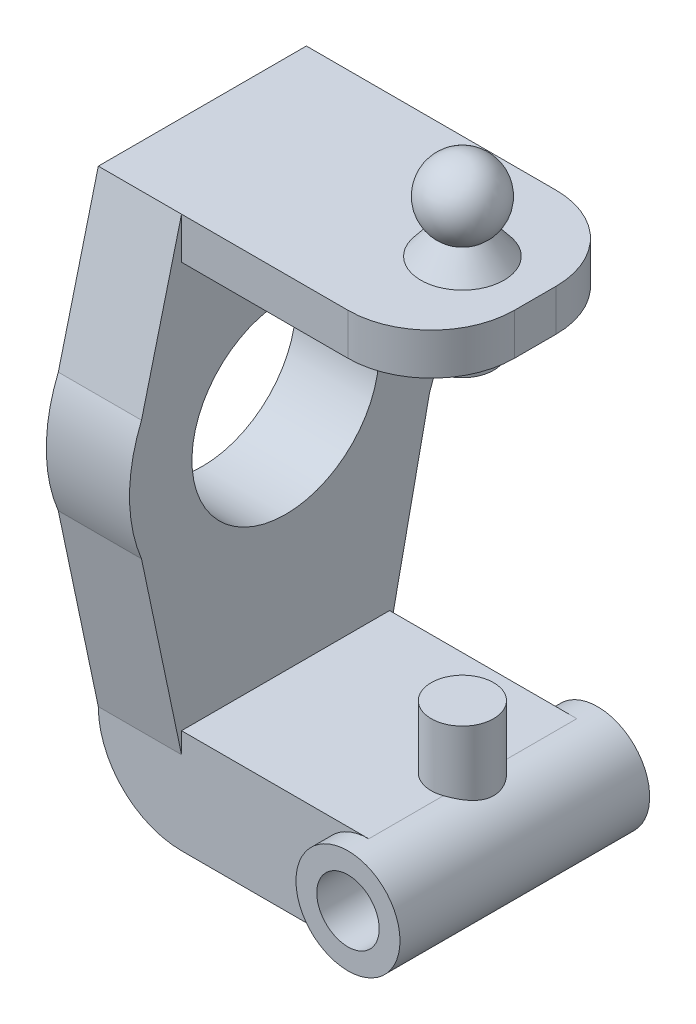
ISO-10303-21;
HEADER;
FILE_DESCRIPTION(('STEP AP214'),'2;1');
FILE_NAME('part.step','',(''),(''),'','','');
FILE_SCHEMA(('AUTOMOTIVE_DESIGN { 1 0 10303 214 1 1 1 1 }'));
ENDSEC;
DATA;
#1=APPLICATION_CONTEXT('core data for automotive mechanical design processes');
#2=APPLICATION_PROTOCOL_DEFINITION('international standard','automotive_design',2000,#1);
#3=PRODUCT_CONTEXT('',#1,'mechanical');
#4=PRODUCT('Part','Part','',(#3));
#5=PRODUCT_RELATED_PRODUCT_CATEGORY('part','',(#4));
#6=PRODUCT_DEFINITION_FORMATION('','',#4);
#7=PRODUCT_DEFINITION_CONTEXT('part definition',#1,'design');
#8=PRODUCT_DEFINITION('design','',#6,#7);
#9=PRODUCT_DEFINITION_SHAPE('','',#8);
#10=(LENGTH_UNIT() NAMED_UNIT(*) SI_UNIT(.MILLI.,.METRE.));
#11=(NAMED_UNIT(*) PLANE_ANGLE_UNIT() SI_UNIT($,.RADIAN.));
#12=(NAMED_UNIT(*) SI_UNIT($,.STERADIAN.) SOLID_ANGLE_UNIT());
#13=UNCERTAINTY_MEASURE_WITH_UNIT(LENGTH_MEASURE(1.E-05),#10,'distance_accuracy_value','');
#14=(GEOMETRIC_REPRESENTATION_CONTEXT(3) GLOBAL_UNCERTAINTY_ASSIGNED_CONTEXT((#13)) GLOBAL_UNIT_ASSIGNED_CONTEXT((#10,
#11,#12)) REPRESENTATION_CONTEXT('',''));
#15=CARTESIAN_POINT('',(0.,0.,0.));
#16=DIRECTION('',(0.,0.,1.));
#17=DIRECTION('',(1.,0.,0.));
#18=AXIS2_PLACEMENT_3D('',#15,#16,#17);
#19=CARTESIAN_POINT('',(4.,4.,10.));
#20=DIRECTION('',(0.,0.,1.));
#21=DIRECTION('',(1.,0.,0.));
#22=AXIS2_PLACEMENT_3D('',#19,#20,#21);
#23=PLANE('',#22);
#24=DIRECTION('',(-1.,0.,0.));
#25=VECTOR('',#24,1.);
#26=CARTESIAN_POINT('',(15.9999999999998,26.4999999999999,10.));
#27=LINE('',#26,#25);
#28=CARTESIAN_POINT('',(11.9999999999998,26.4999999999999,10.));
#29=VERTEX_POINT('',#28);
#30=CARTESIAN_POINT('',(3.99999999999971,26.4999999999999,10.));
#31=VERTEX_POINT('',#30);
#32=EDGE_CURVE('E212',#29,#31,#27,.T.);
#33=ORIENTED_EDGE('',*,*,#32,.T.);
#34=DIRECTION('',(0.,-1.,0.));
#35=VECTOR('',#34,1.);
#36=CARTESIAN_POINT('',(3.99999999999996,4.,10.));
#37=LINE('',#36,#35);
#38=CARTESIAN_POINT('',(3.99999999999979,24.5,10.));
#39=VERTEX_POINT('',#38);
#40=EDGE_CURVE('E193',#31,#39,#37,.T.);
#41=ORIENTED_EDGE('',*,*,#40,.T.);
#42=DIRECTION('',(1.,0.,0.));
#43=VECTOR('',#42,1.);
#44=CARTESIAN_POINT('',(3.99999999999979,24.5,10.));
#45=LINE('',#44,#43);
#46=CARTESIAN_POINT('',(11.9999999999998,24.5,10.));
#47=VERTEX_POINT('',#46);
#48=EDGE_CURVE('E274',#39,#47,#45,.T.);
#49=ORIENTED_EDGE('',*,*,#48,.T.);
#50=DIRECTION('',(0.,1.,0.));
#51=VECTOR('',#50,1.);
#52=CARTESIAN_POINT('',(11.9999999999998,26.4999999999999,10.));
#53=LINE('',#52,#51);
#54=EDGE_CURVE('E247',#47,#29,#53,.T.);
#55=ORIENTED_EDGE('',*,*,#54,.T.);
#56=EDGE_LOOP('',(#33,#41,#49,#55));
#57=FACE_BOUND('',#56,.T.);
#58=ADVANCED_FACE('F35',(#57),#23,.T.);
#59=CARTESIAN_POINT('',(4.,4.,0.));
#60=DIRECTION('',(0.,0.,1.));
#61=DIRECTION('',(1.,0.,0.));
#62=AXIS2_PLACEMENT_3D('',#59,#60,#61);
#63=PLANE('',#62);
#64=DIRECTION('',(0.,-1.,0.));
#65=VECTOR('',#64,1.);
#66=CARTESIAN_POINT('',(3.99999999999996,4.,0.));
#67=LINE('',#66,#65);
#68=CARTESIAN_POINT('',(3.99999999999971,26.5,0.));
#69=VERTEX_POINT('',#68);
#70=CARTESIAN_POINT('',(3.99999999999973,24.5,0.));
#71=VERTEX_POINT('',#70);
#72=EDGE_CURVE('E178',#69,#71,#67,.T.);
#73=ORIENTED_EDGE('',*,*,#72,.F.);
#74=DIRECTION('',(-1.,0.,0.));
#75=VECTOR('',#74,1.);
#76=CARTESIAN_POINT('',(15.9999999999998,26.4999999999999,0.));
#77=LINE('',#76,#75);
#78=CARTESIAN_POINT('',(11.9999999999998,26.4999999999999,0.));
#79=VERTEX_POINT('',#78);
#80=EDGE_CURVE('E189',#79,#69,#77,.T.);
#81=ORIENTED_EDGE('',*,*,#80,.F.);
#82=DIRECTION('',(0.,1.,0.));
#83=VECTOR('',#82,1.);
#84=CARTESIAN_POINT('',(11.9999999999997,3.99999999999997,0.));
#85=LINE('',#84,#83);
#86=CARTESIAN_POINT('',(11.9999999999998,24.5,0.));
#87=VERTEX_POINT('',#86);
#88=EDGE_CURVE('E241',#79,#87,#85,.F.);
#89=ORIENTED_EDGE('',*,*,#88,.T.);
#90=DIRECTION('',(1.,0.,0.));
#91=VECTOR('',#90,1.);
#92=CARTESIAN_POINT('',(3.99999999999979,24.5,0.));
#93=LINE('',#92,#91);
#94=EDGE_CURVE('E192',#71,#87,#93,.T.);
#95=ORIENTED_EDGE('',*,*,#94,.F.);
#96=EDGE_LOOP('',(#73,#81,#89,#95));
#97=FACE_BOUND('',#96,.T.);
#98=ADVANCED_FACE('F188',(#97),#63,.F.);
#99=CARTESIAN_POINT('',(13.,2.5,10.));
#100=DIRECTION('',(0.,0.,-1.));
#101=DIRECTION('',(-1.,0.,0.));
#102=AXIS2_PLACEMENT_3D('',#99,#100,#101);
#103=CYLINDRICAL_SURFACE('',#102,2.5);
#104=CARTESIAN_POINT('',(13.,2.5,11.));
#105=DIRECTION('',(0.,0.,1.));
#106=DIRECTION('',(1.,0.,0.));
#107=AXIS2_PLACEMENT_3D('',#104,#105,#106);
#108=CIRCLE('',#107,2.5);
#109=CARTESIAN_POINT('',(15.5,2.5,11.));
#110=VERTEX_POINT('',#109);
#111=EDGE_CURVE('E387',#110,#110,#108,.T.);
#112=ORIENTED_EDGE('',*,*,#111,.F.);
#113=EDGE_LOOP('',(#112));
#114=FACE_BOUND('',#113,.T.);
#115=CARTESIAN_POINT('',(13.,2.5,-1.));
#116=DIRECTION('',(0.,0.,-1.));
#117=DIRECTION('',(-1.,0.,0.));
#118=AXIS2_PLACEMENT_3D('',#115,#116,#117);
#119=CIRCLE('',#118,2.5);
#120=CARTESIAN_POINT('',(10.5,2.5,-1.));
#121=VERTEX_POINT('',#120);
#122=EDGE_CURVE('E285',#121,#121,#119,.T.);
#123=ORIENTED_EDGE('',*,*,#122,.F.);
#124=EDGE_LOOP('',(#123));
#125=FACE_BOUND('',#124,.T.);
#126=CARTESIAN_POINT('',(13.9999999999998,4.791287847478,5.));
#127=CARTESIAN_POINT('',(13.9999947033153,4.79129466114536,4.91902982811537));
#128=CARTESIAN_POINT('',(13.9934082098024,4.79419981165906,4.83797576123157));
#129=CARTESIAN_POINT('',(13.9673319524589,4.80531081160834,4.67827041177201));
#130=CARTESIAN_POINT('',(13.9478192762301,4.81352607289022,4.59962365574422));
#131=CARTESIAN_POINT('',(13.896741534318,4.83379524979815,4.44723737961263));
#132=CARTESIAN_POINT('',(13.8652227052549,4.84583441010019,4.37348029266181));
#133=CARTESIAN_POINT('',(13.7910603269541,4.87186911270049,4.23218816346976));
#134=CARTESIAN_POINT('',(13.7484154490711,4.88586488856024,4.16465386564289));
#135=CARTESIAN_POINT('',(13.6503192221696,4.91450471744164,4.03365500113123));
#136=CARTESIAN_POINT('',(13.5942925899535,4.92914209638642,3.97061845896466));
#137=CARTESIAN_POINT('',(13.4721255535835,4.95580952497532,3.85454452277904));
#138=CARTESIAN_POINT('',(13.4059849663847,4.967839527421,3.80150730976905));
#139=CARTESIAN_POINT('',(13.2653141747865,4.9868912943366,3.70715585296549));
#140=CARTESIAN_POINT('',(13.1908018840092,4.99392352519673,3.66581721986018));
#141=CARTESIAN_POINT('',(13.0355797767526,5.00094898556523,3.59630256858329));
#142=CARTESIAN_POINT('',(12.9548759878743,5.00094897634477,3.56811393319789));
#143=CARTESIAN_POINT('',(12.7984894426624,4.99297105103094,3.52800751353057));
#144=CARTESIAN_POINT('',(12.7231078550698,4.98578821718202,3.51474814373359));
#145=CARTESIAN_POINT('',(12.5722253082833,4.9643072012322,3.49982419435114));
#146=CARTESIAN_POINT('',(12.4967243691026,4.95001010718521,3.4981578423149));
#147=CARTESIAN_POINT('',(12.3510544630052,4.91541852344314,3.50570502203827));
#148=CARTESIAN_POINT('',(12.280794501245,4.89539943546448,3.51446708920398));
#149=CARTESIAN_POINT('',(12.1438973285934,4.84995662832058,3.54121286836431));
#150=CARTESIAN_POINT('',(12.0772610745585,4.82453149028151,3.55919900306424));
#151=CARTESIAN_POINT('',(11.9425987208532,4.76666542303225,3.60542317605964));
#152=CARTESIAN_POINT('',(11.8750420991718,4.73378743205334,3.63447289377611));
#153=CARTESIAN_POINT('',(11.746388370658,4.66421290927768,3.70102976911739));
#154=CARTESIAN_POINT('',(11.6852952765501,4.62751403309972,3.73854213583592));
#155=CARTESIAN_POINT('',(11.559143405989,4.5446613732338,3.82872621540731));
#156=CARTESIAN_POINT('',(11.4954918775131,4.49802567403082,3.88292168398297));
#157=CARTESIAN_POINT('',(11.3781658470256,4.40402301470902,4.00079181624802));
#158=CARTESIAN_POINT('',(11.3245014626109,4.35665536511124,4.06447597626547));
#159=CARTESIAN_POINT('',(11.2336413572786,4.27014570598054,4.19269941162114));
#160=CARTESIAN_POINT('',(11.1952336905834,4.23070669935142,4.25617908850194));
#161=CARTESIAN_POINT('',(11.1273489322538,4.15700661418471,4.39051523587173));
#162=CARTESIAN_POINT('',(11.0978533191028,4.12273487211329,4.46135599032846));
#163=CARTESIAN_POINT('',(11.0570342646703,4.07339482783833,4.5868262316259));
#164=CARTESIAN_POINT('',(11.0429140502632,4.05568209810313,4.6394859039536));
#165=CARTESIAN_POINT('',(11.0203377152544,4.02685149101053,4.74772551219101));
#166=CARTESIAN_POINT('',(11.0118705769798,4.0157207903495,4.80329953864547));
#167=CARTESIAN_POINT('',(11.0012310367635,4.0016690452409,4.91663240370038));
#168=CARTESIAN_POINT('',(10.9991147716521,3.99882122181047,4.97440618136213));
#169=CARTESIAN_POINT('',(11.001567275606,4.00208795885401,5.08956117181218));
#170=CARTESIAN_POINT('',(11.0061389970681,4.00820647750183,5.14694219998576));
#171=CARTESIAN_POINT('',(11.0222630544285,4.02929407693945,5.26492958137885));
#172=CARTESIAN_POINT('',(11.0344597689819,4.04507701334854,5.32529538154871));
#173=CARTESIAN_POINT('',(11.0653376902947,4.08356808130808,5.44205415332639));
#174=CARTESIAN_POINT('',(11.0840355056846,4.10629393198987,5.4984365000176));
#175=CARTESIAN_POINT('',(11.1376391340598,4.16853537799262,5.63370662728523));
#176=CARTESIAN_POINT('',(11.1759881694794,4.21079771238277,5.70994416283519));
#177=CARTESIAN_POINT('',(11.2634340877537,4.29951370246557,5.85320703026029));
#178=CARTESIAN_POINT('',(11.3125482970288,4.34597404312017,5.92021722444118));
#179=CARTESIAN_POINT('',(11.4231892364001,4.44145256593362,6.04780905264394));
#180=CARTESIAN_POINT('',(11.4851596734395,4.4904946925293,6.10798919310763));
#181=CARTESIAN_POINT('',(11.6196361500555,4.58599801488471,6.21756475449463));
#182=CARTESIAN_POINT('',(11.6921290548821,4.63246232991229,6.26697343137785));
#183=CARTESIAN_POINT('',(11.83733622895,4.71455776851969,6.34791748162733));
#184=CARTESIAN_POINT('',(11.9088706993709,4.75081615880801,6.38092077493516));
#185=CARTESIAN_POINT('',(12.0586831740852,4.81746171744578,6.43582468824335));
#186=CARTESIAN_POINT('',(12.13695838266,4.8478513030836,6.45772988547444));
#187=CARTESIAN_POINT('',(12.2991784603328,4.9012888616434,6.4888034373489));
#188=CARTESIAN_POINT('',(12.3831627935634,4.92427771573521,6.4978711029577));
#189=CARTESIAN_POINT('',(12.5533823798198,4.96131988002796,6.50145774316056));
#190=CARTESIAN_POINT('',(12.6396156042979,4.9753809715385,6.49598940874742));
#191=CARTESIAN_POINT('',(12.7994909397959,4.99307156988658,6.47172209125191));
#192=CARTESIAN_POINT('',(12.8732963211057,4.9978305451557,6.45477254162018));
#193=CARTESIAN_POINT('',(13.0176172692153,5.00097932890752,6.40988677052859));
#194=CARTESIAN_POINT('',(13.088132899685,4.99936926070857,6.38195076179957));
#195=CARTESIAN_POINT('',(13.2224000269212,4.990978526665,6.31666106934536));
#196=CARTESIAN_POINT('',(13.2862645274208,4.98431001281661,6.27952326526576));
#197=CARTESIAN_POINT('',(13.4075304636663,4.96732088159484,6.19657417430765));
#198=CARTESIAN_POINT('',(13.4649302524364,4.95699933632249,6.15076068511221));
#199=CARTESIAN_POINT('',(13.5770745061971,4.93322059120753,6.04702461663845));
#200=CARTESIAN_POINT('',(13.6311105928959,4.91956434995894,5.98838198916769));
#201=CARTESIAN_POINT('',(13.7292351077018,4.89182418192636,5.86331133928975));
#202=CARTESIAN_POINT('',(13.7733143956897,4.87773987553319,5.79687624786792));
#203=CARTESIAN_POINT('',(13.8533983897154,4.85024228810602,5.65240459898935));
#204=CARTESIAN_POINT('',(13.8885585768318,4.83695685058172,5.57387266097269));
#205=CARTESIAN_POINT('',(13.9449985389368,4.8147168507385,5.41149742283211));
#206=CARTESIAN_POINT('',(13.9663098860385,4.80575244961294,5.32766668530225));
#207=CARTESIAN_POINT('',(13.9868237987631,4.79700255031508,5.20250041948364));
#208=CARTESIAN_POINT('',(13.9917576101384,4.79487036808281,5.16219537902944));
#209=CARTESIAN_POINT('',(13.9983470596554,4.79201129818322,5.0812672745524));
#210=CARTESIAN_POINT('',(14.000002658751,4.79128442725425,5.0406442067474));
#211=CARTESIAN_POINT('',(13.9999999999998,4.791287847478,5.));
#212=B_SPLINE_CURVE_WITH_KNOTS('',3,(#126,#127,#128,#129,#130,#131,#132,#133,#134,#135,#136,
#137,#138,#139,#140,#141,#142,#143,#144,#145,#146,#147,#148,#149,#150,#151,#152,#153,#154,#155,
#156,#157,#158,#159,#160,#161,#162,#163,#164,#165,#166,#167,#168,#169,#170,#171,#172,#173,#174,
#175,#176,#177,#178,#179,#180,#181,#182,#183,#184,#185,#186,#187,#188,#189,#190,#191,#192,#193,
#194,#195,#196,#197,#198,#199,#200,#201,#202,#203,#204,#205,#206,#207,#208,#209,#210,#211),
.UNSPECIFIED.,.T.,.F.,(4,2,2,2,2,2,2,2,2,2,2,2,2,2,2,2,2,2,2,2,2,2,2,2,2,2,2,2,2,2,2,2,2,2,2,2,
2,2,2,2,2,2,4),(0.,0.242748105193682,0.485927650764511,0.728180009229197,0.970461310124554,
1.22606593439605,1.48167518520909,1.73674754611882,1.99157466321206,2.22100558352159,
2.45040142547996,2.67021712909591,2.89009059699212,3.13085440720251,3.3717668233517,
3.65788856734964,3.94429861108068,4.19563758597558,4.44645056361101,4.61784267773913,
4.78889977108684,4.96146448841713,5.13410540704983,5.32378394794143,5.51395067285492,
5.79810903790789,6.08272815546154,6.37961304655251,6.67613048593362,6.93527054130685,
7.19430363136125,7.4553573567848,7.71618323805837,7.94267707996984,8.16916653649589,
8.39077610058662,8.61244199571269,8.85413384379524,9.09604666601435,9.35595408738874,
9.6152668824166,9.7371165269493,9.85896762279592),.UNSPECIFIED.);
#213=CARTESIAN_POINT('',(13.,5.,6.41421356237303));
#214=VERTEX_POINT('',#213);
#215=CARTESIAN_POINT('',(13.,5.,3.58578643762697));
#216=VERTEX_POINT('',#215);
#217=EDGE_CURVE('E308',#214,#216,#212,.T.);
#218=ORIENTED_EDGE('',*,*,#217,.F.);
#219=DIRECTION('',(0.,0.,-1.));
#220=VECTOR('',#219,1.);
#221=CARTESIAN_POINT('',(13.,5.,10.));
#222=LINE('',#221,#220);
#223=CARTESIAN_POINT('',(13.,5.,10.));
#224=VERTEX_POINT('',#223);
#225=EDGE_CURVE('E224',#224,#214,#222,.T.);
#226=ORIENTED_EDGE('',*,*,#225,.F.);
#227=CARTESIAN_POINT('',(13.,2.5,10.));
#228=DIRECTION('',(0.,0.,1.));
#229=DIRECTION('',(1.,0.,0.));
#230=AXIS2_PLACEMENT_3D('',#227,#228,#229);
#231=CIRCLE('',#230,2.5);
#232=CARTESIAN_POINT('',(13.,0.,10.));
#233=VERTEX_POINT('',#232);
#234=EDGE_CURVE('E396',#224,#233,#231,.T.);
#235=ORIENTED_EDGE('',*,*,#234,.T.);
#236=DIRECTION('',(0.,0.,-1.));
#237=VECTOR('',#236,1.);
#238=CARTESIAN_POINT('',(13.,0.,10.));
#239=LINE('',#238,#237);
#240=CARTESIAN_POINT('',(13.,0.,0.));
#241=VERTEX_POINT('',#240);
#242=EDGE_CURVE('E226',#233,#241,#239,.T.);
#243=ORIENTED_EDGE('',*,*,#242,.T.);
#244=CARTESIAN_POINT('',(13.,2.5,0.));
#245=DIRECTION('',(0.,0.,-1.));
#246=DIRECTION('',(-1.,0.,0.));
#247=AXIS2_PLACEMENT_3D('',#244,#245,#246);
#248=CIRCLE('',#247,2.5);
#249=CARTESIAN_POINT('',(13.,5.,0.));
#250=VERTEX_POINT('',#249);
#251=EDGE_CURVE('E232',#241,#250,#248,.T.);
#252=ORIENTED_EDGE('',*,*,#251,.T.);
#253=EDGE_CURVE('E223',#216,#250,#222,.T.);
#254=ORIENTED_EDGE('',*,*,#253,.F.);
#255=EDGE_LOOP('',(#218,#226,#235,#243,#252,#254));
#256=FACE_BOUND('',#255,.T.);
#257=ADVANCED_FACE('F319',(#114,#125,#256),#103,.T.);
#258=DIRECTION('',(-1.,0.,0.));
#259=VECTOR('',#258,1.);
#260=CARTESIAN_POINT('',(3.99999999999996,4.00000000000002,10.));
#261=LINE('',#260,#259);
#262=CARTESIAN_POINT('',(3.99999999999996,4.00000000000002,10.));
#263=VERTEX_POINT('',#262);
#264=CARTESIAN_POINT('',(0.,4.,10.));
#265=VERTEX_POINT('',#264);
#266=EDGE_CURVE('E417',#263,#265,#261,.T.);
#267=ORIENTED_EDGE('',*,*,#266,.T.);
#268=CARTESIAN_POINT('',(4.,4.,10.));
#269=DIRECTION('',(0.,0.,1.));
#270=DIRECTION('',(1.,0.,0.));
#271=AXIS2_PLACEMENT_3D('',#268,#269,#270);
#272=CIRCLE('',#271,4.);
#273=CARTESIAN_POINT('',(4.,0.,10.));
#274=VERTEX_POINT('',#273);
#275=EDGE_CURVE('E199',#265,#274,#272,.T.);
#276=ORIENTED_EDGE('',*,*,#275,.T.);
#277=DIRECTION('',(1.,0.,0.));
#278=VECTOR('',#277,1.);
#279=CARTESIAN_POINT('',(4.,0.,10.));
#280=LINE('',#279,#278);
#281=EDGE_CURVE('E202',#274,#233,#280,.T.);
#282=ORIENTED_EDGE('',*,*,#281,.T.);
#283=ORIENTED_EDGE('',*,*,#234,.F.);
#284=DIRECTION('',(-1.,0.,0.));
#285=VECTOR('',#284,1.);
#286=CARTESIAN_POINT('',(13.,5.,10.));
#287=LINE('',#286,#285);
#288=CARTESIAN_POINT('',(3.99999999999973,5.,10.));
#289=VERTEX_POINT('',#288);
#290=EDGE_CURVE('E275',#224,#289,#287,.T.);
#291=ORIENTED_EDGE('',*,*,#290,.T.);
#292=EDGE_CURVE('E50',#289,#263,#37,.T.);
#293=ORIENTED_EDGE('',*,*,#292,.T.);
#294=EDGE_LOOP('',(#267,#276,#282,#283,#291,#293));
#295=FACE_BOUND('',#294,.T.);
#296=ADVANCED_FACE('F351',(#295),#23,.T.);
#297=CARTESIAN_POINT('',(4.,4.,0.));
#298=DIRECTION('',(0.,0.,1.));
#299=DIRECTION('',(1.,0.,0.));
#300=AXIS2_PLACEMENT_3D('',#297,#298,#299);
#301=CIRCLE('',#300,4.);
#302=CARTESIAN_POINT('',(0.,3.99999999999997,0.));
#303=VERTEX_POINT('',#302);
#304=CARTESIAN_POINT('',(4.,0.,0.));
#305=VERTEX_POINT('',#304);
#306=EDGE_CURVE('E281',#303,#305,#301,.T.);
#307=ORIENTED_EDGE('',*,*,#306,.F.);
#308=DIRECTION('',(-1.,0.,0.));
#309=VECTOR('',#308,1.);
#310=CARTESIAN_POINT('',(3.99999999999996,4.00000000000002,0.));
#311=LINE('',#310,#309);
#312=CARTESIAN_POINT('',(3.99999999999996,4.00000000000002,0.));
#313=VERTEX_POINT('',#312);
#314=EDGE_CURVE('E413',#313,#303,#311,.T.);
#315=ORIENTED_EDGE('',*,*,#314,.F.);
#316=CARTESIAN_POINT('',(3.99999999999995,5.,0.));
#317=VERTEX_POINT('',#316);
#318=EDGE_CURVE('E195',#317,#313,#67,.T.);
#319=ORIENTED_EDGE('',*,*,#318,.F.);
#320=DIRECTION('',(-1.,0.,0.));
#321=VECTOR('',#320,1.);
#322=CARTESIAN_POINT('',(13.,5.,0.));
#323=LINE('',#322,#321);
#324=EDGE_CURVE('E204',#250,#317,#323,.T.);
#325=ORIENTED_EDGE('',*,*,#324,.F.);
#326=ORIENTED_EDGE('',*,*,#251,.F.);
#327=DIRECTION('',(1.,0.,0.));
#328=VECTOR('',#327,1.);
#329=CARTESIAN_POINT('',(4.,0.,0.));
#330=LINE('',#329,#328);
#331=EDGE_CURVE('E284',#305,#241,#330,.T.);
#332=ORIENTED_EDGE('',*,*,#331,.F.);
#333=EDGE_LOOP('',(#307,#315,#319,#325,#326,#332));
#334=FACE_BOUND('',#333,.T.);
#335=ADVANCED_FACE('F354',(#334),#63,.F.);
#336=CARTESIAN_POINT('',(4.,4.,10.));
#337=DIRECTION('',(0.,0.,-1.));
#338=DIRECTION('',(-1.,0.,0.));
#339=AXIS2_PLACEMENT_3D('',#336,#337,#338);
#340=CYLINDRICAL_SURFACE('',#339,4.);
#341=ORIENTED_EDGE('',*,*,#306,.T.);
#342=DIRECTION('',(0.,0.,-1.));
#343=VECTOR('',#342,1.);
#344=CARTESIAN_POINT('',(4.,0.,10.));
#345=LINE('',#344,#343);
#346=EDGE_CURVE('E229',#274,#305,#345,.T.);
#347=ORIENTED_EDGE('',*,*,#346,.F.);
#348=ORIENTED_EDGE('',*,*,#275,.F.);
#349=DIRECTION('',(0.,0.,-1.));
#350=VECTOR('',#349,1.);
#351=CARTESIAN_POINT('',(0.,4.,10.));
#352=LINE('',#351,#350);
#353=EDGE_CURVE('E208',#265,#303,#352,.T.);
#354=ORIENTED_EDGE('',*,*,#353,.T.);
#355=EDGE_LOOP('',(#341,#347,#348,#354));
#356=FACE_BOUND('',#355,.T.);
#357=ADVANCED_FACE('F357',(#356),#340,.T.);
#358=CARTESIAN_POINT('',(4.,0.,10.));
#359=DIRECTION('',(0.,1.,0.));
#360=DIRECTION('',(-1.,0.,0.));
#361=AXIS2_PLACEMENT_3D('',#358,#359,#360);
#362=PLANE('',#361);
#363=ORIENTED_EDGE('',*,*,#331,.T.);
#364=ORIENTED_EDGE('',*,*,#242,.F.);
#365=ORIENTED_EDGE('',*,*,#281,.F.);
#366=ORIENTED_EDGE('',*,*,#346,.T.);
#367=EDGE_LOOP('',(#363,#364,#365,#366));
#368=FACE_BOUND('',#367,.T.);
#369=ADVANCED_FACE('F369',(#368),#362,.F.);
#370=CARTESIAN_POINT('',(13.,5.,10.));
#371=DIRECTION('',(0.,-1.,0.));
#372=DIRECTION('',(0.,0.,-1.));
#373=AXIS2_PLACEMENT_3D('',#370,#371,#372);
#374=PLANE('',#373);
#375=CARTESIAN_POINT('',(12.4999999999998,5.,5.));
#376=DIRECTION('',(0.,-1.,0.));
#377=DIRECTION('',(0.,0.,-1.));
#378=AXIS2_PLACEMENT_3D('',#375,#376,#377);
#379=CIRCLE('',#378,1.5);
#380=EDGE_CURVE('E304',#216,#214,#379,.F.);
#381=ORIENTED_EDGE('',*,*,#380,.F.);
#382=ORIENTED_EDGE('',*,*,#253,.T.);
#383=ORIENTED_EDGE('',*,*,#324,.T.);
#384=DIRECTION('',(0.,0.,-1.));
#385=VECTOR('',#384,1.);
#386=CARTESIAN_POINT('',(3.99999999999973,5.,10.));
#387=LINE('',#386,#385);
#388=EDGE_CURVE('E221',#289,#317,#387,.T.);
#389=ORIENTED_EDGE('',*,*,#388,.F.);
#390=ORIENTED_EDGE('',*,*,#290,.F.);
#391=ORIENTED_EDGE('',*,*,#225,.T.);
#392=EDGE_LOOP('',(#381,#382,#383,#389,#390,#391));
#393=FACE_BOUND('',#392,.T.);
#394=ADVANCED_FACE('F291',(#393),#374,.F.);
#395=CARTESIAN_POINT('',(3.99999999999973,5.,10.));
#396=DIRECTION('',(-1.,0.,0.));
#397=DIRECTION('',(0.,-1.,0.));
#398=AXIS2_PLACEMENT_3D('',#395,#396,#397);
#399=PLANE('',#398);
#400=CARTESIAN_POINT('',(3.99999999999983,16.,5.));
#401=DIRECTION('',(-1.,0.,0.));
#402=DIRECTION('',(0.,-1.,0.));
#403=AXIS2_PLACEMENT_3D('',#400,#401,#402);
#404=CIRCLE('',#403,4.5);
#405=CARTESIAN_POINT('',(3.99999999999988,11.5,5.));
#406=VERTEX_POINT('',#405);
#407=EDGE_CURVE('E434',#406,#406,#404,.T.);
#408=ORIENTED_EDGE('',*,*,#407,.T.);
#409=EDGE_LOOP('',(#408));
#410=FACE_BOUND('',#409,.T.);
#411=ORIENTED_EDGE('',*,*,#388,.T.);
#412=ORIENTED_EDGE('',*,*,#318,.T.);
#413=DIRECTION('',(0.,-0.97846208839663,0.206426600927558));
#414=VECTOR('',#413,1.);
#415=CARTESIAN_POINT('',(3.99999999999986,13.1153846153847,-1.92307692307692));
#416=LINE('',#415,#414);
#417=CARTESIAN_POINT('',(3.99999999999986,13.1153846153847,-1.92307692307692));
#418=VERTEX_POINT('',#417);
#419=EDGE_CURVE('E461',#418,#313,#416,.T.);
#420=ORIENTED_EDGE('',*,*,#419,.F.);
#421=CARTESIAN_POINT('',(3.99999999999983,16.,5.));
#422=DIRECTION('',(-1.,0.,0.));
#423=DIRECTION('',(0.,-1.,0.));
#424=AXIS2_PLACEMENT_3D('',#421,#422,#423);
#425=CIRCLE('',#424,7.5);
#426=CARTESIAN_POINT('',(3.9999999999998,18.8846153846155,-1.9230769230769));
#427=VERTEX_POINT('',#426);
#428=EDGE_CURVE('E182',#427,#418,#425,.T.);
#429=ORIENTED_EDGE('',*,*,#428,.F.);
#430=DIRECTION('',(0.,-0.969563670871676,-0.244839310826183));
#431=VECTOR('',#430,1.);
#432=CARTESIAN_POINT('',(3.99999999999971,26.5,0.));
#433=LINE('',#432,#431);
#434=EDGE_CURVE('E164',#69,#427,#433,.T.);
#435=ORIENTED_EDGE('',*,*,#434,.F.);
#436=ORIENTED_EDGE('',*,*,#72,.T.);
#437=DIRECTION('',(0.,0.,-1.));
#438=VECTOR('',#437,1.);
#439=CARTESIAN_POINT('',(3.99999999999979,24.5,10.));
#440=LINE('',#439,#438);
#441=EDGE_CURVE('E219',#39,#71,#440,.T.);
#442=ORIENTED_EDGE('',*,*,#441,.F.);
#443=ORIENTED_EDGE('',*,*,#40,.F.);
#444=DIRECTION('',(0.,0.969563670871676,-0.244839310826183));
#445=VECTOR('',#444,1.);
#446=CARTESIAN_POINT('',(3.99999999999971,26.5,10.));
#447=LINE('',#446,#445);
#448=CARTESIAN_POINT('',(3.9999999999998,18.8846153846155,11.9230769230769));
#449=VERTEX_POINT('',#448);
#450=EDGE_CURVE('E170',#449,#31,#447,.T.);
#451=ORIENTED_EDGE('',*,*,#450,.F.);
#452=CARTESIAN_POINT('',(3.99999999999983,16.,5.));
#453=DIRECTION('',(-1.,0.,0.));
#454=DIRECTION('',(0.,-1.,0.));
#455=AXIS2_PLACEMENT_3D('',#452,#453,#454);
#456=CIRCLE('',#455,7.5);
#457=CARTESIAN_POINT('',(3.99999999999986,13.1153846153847,11.9230769230769));
#458=VERTEX_POINT('',#457);
#459=EDGE_CURVE('E466',#458,#449,#456,.T.);
#460=ORIENTED_EDGE('',*,*,#459,.F.);
#461=DIRECTION('',(0.,0.97846208839663,0.206426600927558));
#462=VECTOR('',#461,1.);
#463=CARTESIAN_POINT('',(3.99999999999986,13.1153846153847,11.9230769230769));
#464=LINE('',#463,#462);
#465=EDGE_CURVE('E299',#263,#458,#464,.T.);
#466=ORIENTED_EDGE('',*,*,#465,.F.);
#467=ORIENTED_EDGE('',*,*,#292,.F.);
#468=EDGE_LOOP('',(#411,#412,#420,#429,#435,#436,#442,#443,#451,#460,#466,#467));
#469=FACE_BOUND('',#468,.T.);
#470=ADVANCED_FACE('F176',(#410,#469),#399,.F.);
#471=CARTESIAN_POINT('',(3.99999999999979,24.5,10.));
#472=DIRECTION('',(0.,1.,0.));
#473=DIRECTION('',(-1.,0.,0.));
#474=AXIS2_PLACEMENT_3D('',#471,#472,#473);
#475=PLANE('',#474);
#476=CARTESIAN_POINT('',(12.4999999999998,24.4999999999999,5.));
#477=DIRECTION('',(0.,1.,0.));
#478=DIRECTION('',(-1.,0.,0.));
#479=AXIS2_PLACEMENT_3D('',#476,#477,#478);
#480=CIRCLE('',#479,1.5);
#481=CARTESIAN_POINT('',(10.9999999999998,24.5,5.));
#482=VERTEX_POINT('',#481);
#483=EDGE_CURVE('E43',#482,#482,#480,.F.);
#484=ORIENTED_EDGE('',*,*,#483,.F.);
#485=EDGE_LOOP('',(#484));
#486=FACE_BOUND('',#485,.T.);
#487=ORIENTED_EDGE('',*,*,#94,.T.);
#488=CARTESIAN_POINT('',(11.9999999999998,24.5,4.));
#489=DIRECTION('',(0.,1.,0.));
#490=DIRECTION('',(-1.,0.,0.));
#491=AXIS2_PLACEMENT_3D('',#488,#489,#490);
#492=CIRCLE('',#491,4.);
#493=CARTESIAN_POINT('',(15.9999999999998,24.4999999999999,4.));
#494=VERTEX_POINT('',#493);
#495=EDGE_CURVE('E245',#87,#494,#492,.F.);
#496=ORIENTED_EDGE('',*,*,#495,.T.);
#497=DIRECTION('',(0.,0.,-1.));
#498=VECTOR('',#497,1.);
#499=CARTESIAN_POINT('',(15.9999999999998,24.4999999999999,10.));
#500=LINE('',#499,#498);
#501=CARTESIAN_POINT('',(15.9999999999998,24.4999999999999,6.));
#502=VERTEX_POINT('',#501);
#503=EDGE_CURVE('E216',#502,#494,#500,.T.);
#504=ORIENTED_EDGE('',*,*,#503,.F.);
#505=CARTESIAN_POINT('',(11.9999999999998,24.5,6.));
#506=DIRECTION('',(0.,1.,0.));
#507=DIRECTION('',(-1.,0.,0.));
#508=AXIS2_PLACEMENT_3D('',#505,#506,#507);
#509=CIRCLE('',#508,4.);
#510=EDGE_CURVE('E243',#502,#47,#509,.F.);
#511=ORIENTED_EDGE('',*,*,#510,.T.);
#512=ORIENTED_EDGE('',*,*,#48,.F.);
#513=ORIENTED_EDGE('',*,*,#441,.T.);
#514=EDGE_LOOP('',(#487,#496,#504,#511,#512,#513));
#515=FACE_BOUND('',#514,.T.);
#516=ADVANCED_FACE('F254',(#486,#515),#475,.F.);
#517=CARTESIAN_POINT('',(15.9999999999998,24.4999999999999,10.));
#518=DIRECTION('',(-1.,0.,0.));
#519=DIRECTION('',(0.,-1.,0.));
#520=AXIS2_PLACEMENT_3D('',#517,#518,#519);
#521=PLANE('',#520);
#522=ORIENTED_EDGE('',*,*,#503,.T.);
#523=DIRECTION('',(0.,1.,0.));
#524=VECTOR('',#523,1.);
#525=CARTESIAN_POINT('',(15.9999999999998,24.4999999999999,4.));
#526=LINE('',#525,#524);
#527=CARTESIAN_POINT('',(15.9999999999998,26.4999999999999,4.));
#528=VERTEX_POINT('',#527);
#529=EDGE_CURVE('E235',#494,#528,#526,.T.);
#530=ORIENTED_EDGE('',*,*,#529,.T.);
#531=DIRECTION('',(0.,0.,-1.));
#532=VECTOR('',#531,1.);
#533=CARTESIAN_POINT('',(15.9999999999998,26.4999999999999,10.));
#534=LINE('',#533,#532);
#535=CARTESIAN_POINT('',(15.9999999999998,26.4999999999999,6.));
#536=VERTEX_POINT('',#535);
#537=EDGE_CURVE('E214',#536,#528,#534,.T.);
#538=ORIENTED_EDGE('',*,*,#537,.F.);
#539=DIRECTION('',(0.,1.,0.));
#540=VECTOR('',#539,1.);
#541=CARTESIAN_POINT('',(15.9999999999998,24.4999999999999,6.));
#542=LINE('',#541,#540);
#543=EDGE_CURVE('E233',#536,#502,#542,.F.);
#544=ORIENTED_EDGE('',*,*,#543,.T.);
#545=EDGE_LOOP('',(#522,#530,#538,#544));
#546=FACE_BOUND('',#545,.T.);
#547=ADVANCED_FACE('F257',(#546),#521,.F.);
#548=CARTESIAN_POINT('',(15.9999999999998,26.4999999999999,10.));
#549=DIRECTION('',(0.,-1.,0.));
#550=DIRECTION('',(1.,0.,0.));
#551=AXIS2_PLACEMENT_3D('',#548,#549,#550);
#552=PLANE('',#551);
#553=CARTESIAN_POINT('',(12.4999999999997,26.4999999999999,5.));
#554=DIRECTION('',(0.,-1.,0.));
#555=DIRECTION('',(1.,0.,0.));
#556=AXIS2_PLACEMENT_3D('',#553,#554,#555);
#557=CIRCLE('',#556,2.00000000000006);
#558=CARTESIAN_POINT('',(14.4999999999998,26.4999999999999,5.));
#559=VERTEX_POINT('',#558);
#560=EDGE_CURVE('E11',#559,#559,#557,.F.);
#561=ORIENTED_EDGE('',*,*,#560,.F.);
#562=EDGE_LOOP('',(#561));
#563=FACE_BOUND('',#562,.T.);
#564=DIRECTION('',(-1.,0.,0.));
#565=VECTOR('',#564,1.);
#566=CARTESIAN_POINT('',(3.99999999999971,26.5,10.));
#567=LINE('',#566,#565);
#568=CARTESIAN_POINT('',(-2.87505389497282E-13,26.4999999999999,10.));
#569=VERTEX_POINT('',#568);
#570=EDGE_CURVE('E58',#31,#569,#567,.T.);
#571=ORIENTED_EDGE('',*,*,#570,.F.);
#572=ORIENTED_EDGE('',*,*,#32,.F.);
#573=CARTESIAN_POINT('',(11.9999999999998,26.4999999999999,6.));
#574=DIRECTION('',(0.,-1.,0.));
#575=DIRECTION('',(1.,0.,0.));
#576=AXIS2_PLACEMENT_3D('',#573,#574,#575);
#577=CIRCLE('',#576,4.);
#578=EDGE_CURVE('E238',#29,#536,#577,.F.);
#579=ORIENTED_EDGE('',*,*,#578,.T.);
#580=ORIENTED_EDGE('',*,*,#537,.T.);
#581=CARTESIAN_POINT('',(11.9999999999998,26.4999999999999,4.));
#582=DIRECTION('',(0.,-1.,0.));
#583=DIRECTION('',(1.,0.,0.));
#584=AXIS2_PLACEMENT_3D('',#581,#582,#583);
#585=CIRCLE('',#584,4.);
#586=EDGE_CURVE('E198',#528,#79,#585,.F.);
#587=ORIENTED_EDGE('',*,*,#586,.T.);
#588=ORIENTED_EDGE('',*,*,#80,.T.);
#589=DIRECTION('',(-1.,0.,0.));
#590=VECTOR('',#589,1.);
#591=CARTESIAN_POINT('',(3.99999999999971,26.5,0.));
#592=LINE('',#591,#590);
#593=CARTESIAN_POINT('',(0.,26.4999999999999,0.));
#594=VERTEX_POINT('',#593);
#595=EDGE_CURVE('E161',#69,#594,#592,.T.);
#596=ORIENTED_EDGE('',*,*,#595,.T.);
#597=DIRECTION('',(0.,0.,-1.));
#598=VECTOR('',#597,1.);
#599=CARTESIAN_POINT('',(0.,26.4999999999999,10.));
#600=LINE('',#599,#598);
#601=EDGE_CURVE('E211',#569,#594,#600,.T.);
#602=ORIENTED_EDGE('',*,*,#601,.F.);
#603=EDGE_LOOP('',(#571,#572,#579,#580,#587,#588,#596,#602));
#604=FACE_BOUND('',#603,.T.);
#605=ADVANCED_FACE('F196',(#563,#604),#552,.F.);
#606=CARTESIAN_POINT('',(0.,26.4999999999999,10.));
#607=DIRECTION('',(1.,0.,0.));
#608=DIRECTION('',(0.,1.,0.));
#609=AXIS2_PLACEMENT_3D('',#606,#607,#608);
#610=PLANE('',#609);
#611=CARTESIAN_POINT('',(-1.73588159696473E-13,16.,5.));
#612=DIRECTION('',(-1.,0.,0.));
#613=DIRECTION('',(0.,-1.,0.));
#614=AXIS2_PLACEMENT_3D('',#611,#612,#613);
#615=CIRCLE('',#614,4.5);
#616=CARTESIAN_POINT('',(-1.2476648978184E-13,11.5,5.));
#617=VERTEX_POINT('',#616);
#618=EDGE_CURVE('E437',#617,#617,#615,.T.);
#619=ORIENTED_EDGE('',*,*,#618,.F.);
#620=EDGE_LOOP('',(#619));
#621=FACE_BOUND('',#620,.T.);
#622=ORIENTED_EDGE('',*,*,#601,.T.);
#623=DIRECTION('',(0.,-0.969563670871676,-0.244839310826183));
#624=VECTOR('',#623,1.);
#625=CARTESIAN_POINT('',(-2.87505389497282E-13,26.4999999999999,0.));
#626=LINE('',#625,#624);
#627=CARTESIAN_POINT('',(-2.04884101949443E-13,18.8846153846154,-1.9230769230769));
#628=VERTEX_POINT('',#627);
#629=EDGE_CURVE('E166',#594,#628,#626,.T.);
#630=ORIENTED_EDGE('',*,*,#629,.T.);
#631=CARTESIAN_POINT('',(-1.73588159696473E-13,16.,5.));
#632=DIRECTION('',(-1.,0.,0.));
#633=DIRECTION('',(0.,-1.,0.));
#634=AXIS2_PLACEMENT_3D('',#631,#632,#633);
#635=CIRCLE('',#634,7.5);
#636=CARTESIAN_POINT('',(-1.42292217443503E-13,13.1153846153846,-1.92307692307692));
#637=VERTEX_POINT('',#636);
#638=EDGE_CURVE('E428',#628,#637,#635,.T.);
#639=ORIENTED_EDGE('',*,*,#638,.T.);
#640=DIRECTION('',(0.,-0.97846208839663,0.206426600927558));
#641=VECTOR('',#640,1.);
#642=CARTESIAN_POINT('',(-1.42292217443503E-13,13.1153846153846,-1.92307692307692));
#643=LINE('',#642,#641);
#644=EDGE_CURVE('E431',#637,#303,#643,.T.);
#645=ORIENTED_EDGE('',*,*,#644,.T.);
#646=ORIENTED_EDGE('',*,*,#353,.F.);
#647=DIRECTION('',(0.,0.97846208839663,0.206426600927558));
#648=VECTOR('',#647,1.);
#649=CARTESIAN_POINT('',(-1.42292217443503E-13,13.1153846153846,11.9230769230769));
#650=LINE('',#649,#648);
#651=CARTESIAN_POINT('',(-1.42292217443503E-13,13.1153846153846,11.9230769230769));
#652=VERTEX_POINT('',#651);
#653=EDGE_CURVE('E443',#265,#652,#650,.T.);
#654=ORIENTED_EDGE('',*,*,#653,.T.);
#655=CARTESIAN_POINT('',(-1.73588159696473E-13,16.,5.));
#656=DIRECTION('',(-1.,0.,0.));
#657=DIRECTION('',(0.,-1.,0.));
#658=AXIS2_PLACEMENT_3D('',#655,#656,#657);
#659=CIRCLE('',#658,7.5);
#660=CARTESIAN_POINT('',(-2.04884101949443E-13,18.8846153846154,11.9230769230769));
#661=VERTEX_POINT('',#660);
#662=EDGE_CURVE('E446',#652,#661,#659,.T.);
#663=ORIENTED_EDGE('',*,*,#662,.T.);
#664=DIRECTION('',(0.,0.969563670871676,-0.244839310826183));
#665=VECTOR('',#664,1.);
#666=CARTESIAN_POINT('',(-2.87505389497282E-13,26.4999999999999,10.));
#667=LINE('',#666,#665);
#668=EDGE_CURVE('E183',#661,#569,#667,.T.);
#669=ORIENTED_EDGE('',*,*,#668,.T.);
#670=EDGE_LOOP('',(#622,#630,#639,#645,#646,#654,#663,#669));
#671=FACE_BOUND('',#670,.T.);
#672=ADVANCED_FACE('F349',(#621,#671),#610,.F.);
#673=CARTESIAN_POINT('',(13.,2.5,10.));
#674=DIRECTION('',(0.,0.,-1.));
#675=DIRECTION('',(-1.,0.,0.));
#676=AXIS2_PLACEMENT_3D('',#673,#674,#675);
#677=CYLINDRICAL_SURFACE('',#676,1.5);
#678=CARTESIAN_POINT('',(13.,2.5,-1.));
#679=DIRECTION('',(0.,0.,-1.));
#680=DIRECTION('',(-1.,0.,0.));
#681=AXIS2_PLACEMENT_3D('',#678,#679,#680);
#682=CIRCLE('',#681,1.5);
#683=CARTESIAN_POINT('',(11.5,2.5,-1.));
#684=VERTEX_POINT('',#683);
#685=EDGE_CURVE('E400',#684,#684,#682,.T.);
#686=ORIENTED_EDGE('',*,*,#685,.T.);
#687=EDGE_LOOP('',(#686));
#688=FACE_BOUND('',#687,.T.);
#689=CARTESIAN_POINT('',(13.,2.5,11.));
#690=DIRECTION('',(0.,0.,1.));
#691=DIRECTION('',(1.,0.,0.));
#692=AXIS2_PLACEMENT_3D('',#689,#690,#691);
#693=CIRCLE('',#692,1.5);
#694=CARTESIAN_POINT('',(14.5,2.5,11.));
#695=VERTEX_POINT('',#694);
#696=EDGE_CURVE('E398',#695,#695,#693,.T.);
#697=ORIENTED_EDGE('',*,*,#696,.T.);
#698=EDGE_LOOP('',(#697));
#699=FACE_BOUND('',#698,.T.);
#700=ADVANCED_FACE('F345',(#688,#699),#677,.F.);
#701=CARTESIAN_POINT('',(13.,2.5,-1.));
#702=DIRECTION('',(0.,0.,-1.));
#703=DIRECTION('',(-1.,0.,0.));
#704=AXIS2_PLACEMENT_3D('',#701,#702,#703);
#705=PLANE('',#704);
#706=ORIENTED_EDGE('',*,*,#122,.T.);
#707=EDGE_LOOP('',(#706));
#708=FACE_BOUND('',#707,.T.);
#709=ORIENTED_EDGE('',*,*,#685,.F.);
#710=EDGE_LOOP('',(#709));
#711=FACE_BOUND('',#710,.T.);
#712=ADVANCED_FACE('F341',(#708,#711),#705,.T.);
#713=CARTESIAN_POINT('',(13.,2.5,11.));
#714=DIRECTION('',(0.,0.,1.));
#715=DIRECTION('',(1.,0.,0.));
#716=AXIS2_PLACEMENT_3D('',#713,#714,#715);
#717=PLANE('',#716);
#718=ORIENTED_EDGE('',*,*,#111,.T.);
#719=EDGE_LOOP('',(#718));
#720=FACE_BOUND('',#719,.T.);
#721=ORIENTED_EDGE('',*,*,#696,.F.);
#722=EDGE_LOOP('',(#721));
#723=FACE_BOUND('',#722,.T.);
#724=ADVANCED_FACE('F338',(#720,#723),#717,.T.);
#725=CARTESIAN_POINT('',(11.9999999999998,24.4999999999999,4.));
#726=DIRECTION('',(0.,1.,0.));
#727=DIRECTION('',(-1.,0.,0.));
#728=AXIS2_PLACEMENT_3D('',#725,#726,#727);
#729=CYLINDRICAL_SURFACE('',#728,4.);
#730=ORIENTED_EDGE('',*,*,#495,.F.);
#731=ORIENTED_EDGE('',*,*,#88,.F.);
#732=ORIENTED_EDGE('',*,*,#586,.F.);
#733=ORIENTED_EDGE('',*,*,#529,.F.);
#734=EDGE_LOOP('',(#730,#731,#732,#733));
#735=FACE_BOUND('',#734,.T.);
#736=ADVANCED_FACE('F264',(#735),#729,.T.);
#737=CARTESIAN_POINT('',(11.9999999999997,3.99999999999997,6.));
#738=DIRECTION('',(0.,-1.,0.));
#739=DIRECTION('',(1.,0.,0.));
#740=AXIS2_PLACEMENT_3D('',#737,#738,#739);
#741=CYLINDRICAL_SURFACE('',#740,4.);
#742=ORIENTED_EDGE('',*,*,#510,.F.);
#743=ORIENTED_EDGE('',*,*,#543,.F.);
#744=ORIENTED_EDGE('',*,*,#578,.F.);
#745=ORIENTED_EDGE('',*,*,#54,.F.);
#746=EDGE_LOOP('',(#742,#743,#744,#745));
#747=FACE_BOUND('',#746,.T.);
#748=ADVANCED_FACE('F37',(#747),#741,.T.);
#749=CARTESIAN_POINT('',(12.4999999999998,22.4999999999999,5.));
#750=DIRECTION('',(0.,1.,0.));
#751=DIRECTION('',(-1.,0.,0.));
#752=AXIS2_PLACEMENT_3D('',#749,#750,#751);
#753=CYLINDRICAL_SURFACE('',#752,1.5);
#754=CARTESIAN_POINT('',(12.4999999999998,22.4999999999999,5.));
#755=DIRECTION('',(0.,-1.,0.));
#756=DIRECTION('',(1.,0.,0.));
#757=AXIS2_PLACEMENT_3D('',#754,#755,#756);
#758=CIRCLE('',#757,1.5);
#759=CARTESIAN_POINT('',(13.9999999999998,22.4999999999999,5.));
#760=VERTEX_POINT('',#759);
#761=EDGE_CURVE('E317',#760,#760,#758,.T.);
#762=ORIENTED_EDGE('',*,*,#761,.F.);
#763=EDGE_LOOP('',(#762));
#764=FACE_BOUND('',#763,.T.);
#765=ORIENTED_EDGE('',*,*,#483,.T.);
#766=EDGE_LOOP('',(#765));
#767=FACE_BOUND('',#766,.T.);
#768=ADVANCED_FACE('F252',(#764,#767),#753,.T.);
#769=CARTESIAN_POINT('',(12.4999999999998,22.4999999999999,5.));
#770=DIRECTION('',(0.,-1.,0.));
#771=DIRECTION('',(1.,0.,0.));
#772=AXIS2_PLACEMENT_3D('',#769,#770,#771);
#773=PLANE('',#772);
#774=ORIENTED_EDGE('',*,*,#761,.T.);
#775=EDGE_LOOP('',(#774));
#776=FACE_BOUND('',#775,.T.);
#777=ADVANCED_FACE('F329',(#776),#773,.T.);
#778=CARTESIAN_POINT('',(12.4999999999998,6.00000000000012,5.));
#779=DIRECTION('',(0.,-1.,0.));
#780=DIRECTION('',(1.,0.,0.));
#781=AXIS2_PLACEMENT_3D('',#778,#779,#780);
#782=CYLINDRICAL_SURFACE('',#781,1.5);
#783=ORIENTED_EDGE('',*,*,#380,.T.);
#784=ORIENTED_EDGE('',*,*,#217,.T.);
#785=EDGE_LOOP('',(#783,#784));
#786=FACE_BOUND('',#785,.T.);
#787=CARTESIAN_POINT('',(12.4999999999997,8.00000000000012,5.));
#788=DIRECTION('',(0.,1.,0.));
#789=DIRECTION('',(-1.,0.,0.));
#790=AXIS2_PLACEMENT_3D('',#787,#788,#789);
#791=CIRCLE('',#790,1.5);
#792=CARTESIAN_POINT('',(10.9999999999997,8.0000000000001,5.));
#793=VERTEX_POINT('',#792);
#794=EDGE_CURVE('E302',#793,#793,#791,.T.);
#795=ORIENTED_EDGE('',*,*,#794,.F.);
#796=EDGE_LOOP('',(#795));
#797=FACE_BOUND('',#796,.T.);
#798=ADVANCED_FACE('F323',(#786,#797),#782,.T.);
#799=CARTESIAN_POINT('',(12.4999999999997,8.00000000000012,5.));
#800=DIRECTION('',(0.,1.,0.));
#801=DIRECTION('',(-1.,0.,0.));
#802=AXIS2_PLACEMENT_3D('',#799,#800,#801);
#803=PLANE('',#802);
#804=ORIENTED_EDGE('',*,*,#794,.T.);
#805=EDGE_LOOP('',(#804));
#806=FACE_BOUND('',#805,.T.);
#807=ADVANCED_FACE('F328',(#806),#803,.T.);
#808=CARTESIAN_POINT('',(3.99999999999983,16.,5.));
#809=DIRECTION('',(-1.,0.,0.));
#810=DIRECTION('',(0.,-1.,0.));
#811=AXIS2_PLACEMENT_3D('',#808,#809,#810);
#812=CYLINDRICAL_SURFACE('',#811,7.5);
#813=ORIENTED_EDGE('',*,*,#638,.F.);
#814=DIRECTION('',(-1.,0.,0.));
#815=VECTOR('',#814,1.);
#816=CARTESIAN_POINT('',(3.9999999999998,18.8846153846155,-1.9230769230769));
#817=LINE('',#816,#815);
#818=EDGE_CURVE('E169',#427,#628,#817,.T.);
#819=ORIENTED_EDGE('',*,*,#818,.F.);
#820=ORIENTED_EDGE('',*,*,#428,.T.);
#821=DIRECTION('',(-1.,0.,0.));
#822=VECTOR('',#821,1.);
#823=CARTESIAN_POINT('',(3.99999999999986,13.1153846153847,-1.92307692307692));
#824=LINE('',#823,#822);
#825=EDGE_CURVE('E418',#418,#637,#824,.T.);
#826=ORIENTED_EDGE('',*,*,#825,.T.);
#827=EDGE_LOOP('',(#813,#819,#820,#826));
#828=FACE_BOUND('',#827,.T.);
#829=ADVANCED_FACE('F429',(#828),#812,.T.);
#830=CARTESIAN_POINT('',(3.99999999999971,26.5,0.));
#831=DIRECTION('',(0.,0.244839310826183,-0.969563670871676));
#832=DIRECTION('',(0.,0.969563670871676,0.244839310826183));
#833=AXIS2_PLACEMENT_3D('',#830,#831,#832);
#834=PLANE('',#833);
#835=ORIENTED_EDGE('',*,*,#629,.F.);
#836=ORIENTED_EDGE('',*,*,#595,.F.);
#837=ORIENTED_EDGE('',*,*,#434,.T.);
#838=ORIENTED_EDGE('',*,*,#818,.T.);
#839=EDGE_LOOP('',(#835,#836,#837,#838));
#840=FACE_BOUND('',#839,.T.);
#841=ADVANCED_FACE('F163',(#840),#834,.T.);
#842=CARTESIAN_POINT('',(3.99999999999986,13.1153846153847,-1.92307692307692));
#843=DIRECTION('',(0.,-0.206426600927558,-0.97846208839663));
#844=DIRECTION('',(0.,0.97846208839663,-0.206426600927558));
#845=AXIS2_PLACEMENT_3D('',#842,#843,#844);
#846=PLANE('',#845);
#847=ORIENTED_EDGE('',*,*,#644,.F.);
#848=ORIENTED_EDGE('',*,*,#825,.F.);
#849=ORIENTED_EDGE('',*,*,#419,.T.);
#850=ORIENTED_EDGE('',*,*,#314,.T.);
#851=EDGE_LOOP('',(#847,#848,#849,#850));
#852=FACE_BOUND('',#851,.T.);
#853=ADVANCED_FACE('F460',(#852),#846,.T.);
#854=CARTESIAN_POINT('',(3.99999999999971,26.5,10.));
#855=DIRECTION('',(0.,0.244839310826183,0.969563670871676));
#856=DIRECTION('',(0.,-0.969563670871676,0.244839310826183));
#857=AXIS2_PLACEMENT_3D('',#854,#855,#856);
#858=PLANE('',#857);
#859=ORIENTED_EDGE('',*,*,#668,.F.);
#860=DIRECTION('',(-1.,0.,0.));
#861=VECTOR('',#860,1.);
#862=CARTESIAN_POINT('',(3.9999999999998,18.8846153846155,11.9230769230769));
#863=LINE('',#862,#861);
#864=EDGE_CURVE('E451',#449,#661,#863,.T.);
#865=ORIENTED_EDGE('',*,*,#864,.F.);
#866=ORIENTED_EDGE('',*,*,#450,.T.);
#867=ORIENTED_EDGE('',*,*,#570,.T.);
#868=EDGE_LOOP('',(#859,#865,#866,#867));
#869=FACE_BOUND('',#868,.T.);
#870=ADVANCED_FACE('F470',(#869),#858,.T.);
#871=CARTESIAN_POINT('',(3.99999999999983,16.,5.));
#872=DIRECTION('',(-1.,0.,0.));
#873=DIRECTION('',(0.,-1.,0.));
#874=AXIS2_PLACEMENT_3D('',#871,#872,#873);
#875=CYLINDRICAL_SURFACE('',#874,7.5);
#876=ORIENTED_EDGE('',*,*,#662,.F.);
#877=DIRECTION('',(-1.,0.,0.));
#878=VECTOR('',#877,1.);
#879=CARTESIAN_POINT('',(3.99999999999986,13.1153846153847,11.9230769230769));
#880=LINE('',#879,#878);
#881=EDGE_CURVE('E420',#458,#652,#880,.T.);
#882=ORIENTED_EDGE('',*,*,#881,.F.);
#883=ORIENTED_EDGE('',*,*,#459,.T.);
#884=ORIENTED_EDGE('',*,*,#864,.T.);
#885=EDGE_LOOP('',(#876,#882,#883,#884));
#886=FACE_BOUND('',#885,.T.);
#887=ADVANCED_FACE('F458',(#886),#875,.T.);
#888=CARTESIAN_POINT('',(3.99999999999986,13.1153846153847,11.9230769230769));
#889=DIRECTION('',(0.,-0.206426600927558,0.97846208839663));
#890=DIRECTION('',(0.,-0.97846208839663,-0.206426600927558));
#891=AXIS2_PLACEMENT_3D('',#888,#889,#890);
#892=PLANE('',#891);
#893=ORIENTED_EDGE('',*,*,#653,.F.);
#894=ORIENTED_EDGE('',*,*,#266,.F.);
#895=ORIENTED_EDGE('',*,*,#465,.T.);
#896=ORIENTED_EDGE('',*,*,#881,.T.);
#897=EDGE_LOOP('',(#893,#894,#895,#896));
#898=FACE_BOUND('',#897,.T.);
#899=ADVANCED_FACE('F455',(#898),#892,.T.);
#900=CARTESIAN_POINT('',(3.99999999999983,16.,5.));
#901=DIRECTION('',(-1.,0.,0.));
#902=DIRECTION('',(0.,-1.,0.));
#903=AXIS2_PLACEMENT_3D('',#900,#901,#902);
#904=CYLINDRICAL_SURFACE('',#903,4.5);
#905=ORIENTED_EDGE('',*,*,#407,.F.);
#906=EDGE_LOOP('',(#905));
#907=FACE_BOUND('',#906,.T.);
#908=ORIENTED_EDGE('',*,*,#618,.T.);
#909=EDGE_LOOP('',(#908));
#910=FACE_BOUND('',#909,.T.);
#911=ADVANCED_FACE('F480',(#907,#910),#904,.F.);
#912=CARTESIAN_POINT('',(12.4999999999997,29.,5.));
#913=DIRECTION('',(0.,-1.,0.));
#914=DIRECTION('',(0.,0.,-1.));
#915=AXIS2_PLACEMENT_3D('',#912,#913,#914);
#916=SPHERICAL_SURFACE('',#915,1.73929653567883);
#917=CARTESIAN_POINT('',(12.4999999999997,27.6418375849161,5.));
#918=DIRECTION('',(0.,-1.,0.));
#919=DIRECTION('',(1.,0.,0.));
#920=AXIS2_PLACEMENT_3D('',#917,#918,#919);
#921=CIRCLE('',#920,1.08652993206713);
#922=CARTESIAN_POINT('',(13.5865299320668,27.6418375849161,5.));
#923=VERTEX_POINT('',#922);
#924=EDGE_CURVE('E570',#923,#923,#921,.T.);
#925=ORIENTED_EDGE('',*,*,#924,.F.);
#926=EDGE_LOOP('',(#925));
#927=FACE_BOUND('',#926,.T.);
#928=ADVANCED_FACE('F537',(#927),#916,.T.);
#929=CARTESIAN_POINT('',(12.4999999999997,27.6418375849161,5.));
#930=DIRECTION('',(0.,-1.,0.));
#931=DIRECTION('',(1.,0.,0.));
#932=AXIS2_PLACEMENT_3D('',#929,#930,#931);
#933=CONICAL_SURFACE('',#932,1.08652993206713,0.674740942223552);
#934=ORIENTED_EDGE('',*,*,#560,.T.);
#935=EDGE_LOOP('',(#934));
#936=FACE_BOUND('',#935,.T.);
#937=ORIENTED_EDGE('',*,*,#924,.T.);
#938=EDGE_LOOP('',(#937));
#939=FACE_BOUND('',#938,.T.);
#940=ADVANCED_FACE('F553',(#936,#939),#933,.T.);
#941=CLOSED_SHELL('',(#58,#98,#257,#296,#335,#357,#369,#394,#470,#516,#547,#605,#672,#700,#712,
#724,#736,#748,#768,#777,#798,#807,#829,#841,#853,#870,#887,#899,#911,#928,#940));
#942=MANIFOLD_SOLID_BREP('B2',#941);
#943=ADVANCED_BREP_SHAPE_REPRESENTATION('',(#18,#942),#14);
#944=SHAPE_DEFINITION_REPRESENTATION(#9,#943);
ENDSEC;
END-ISO-10303-21;
